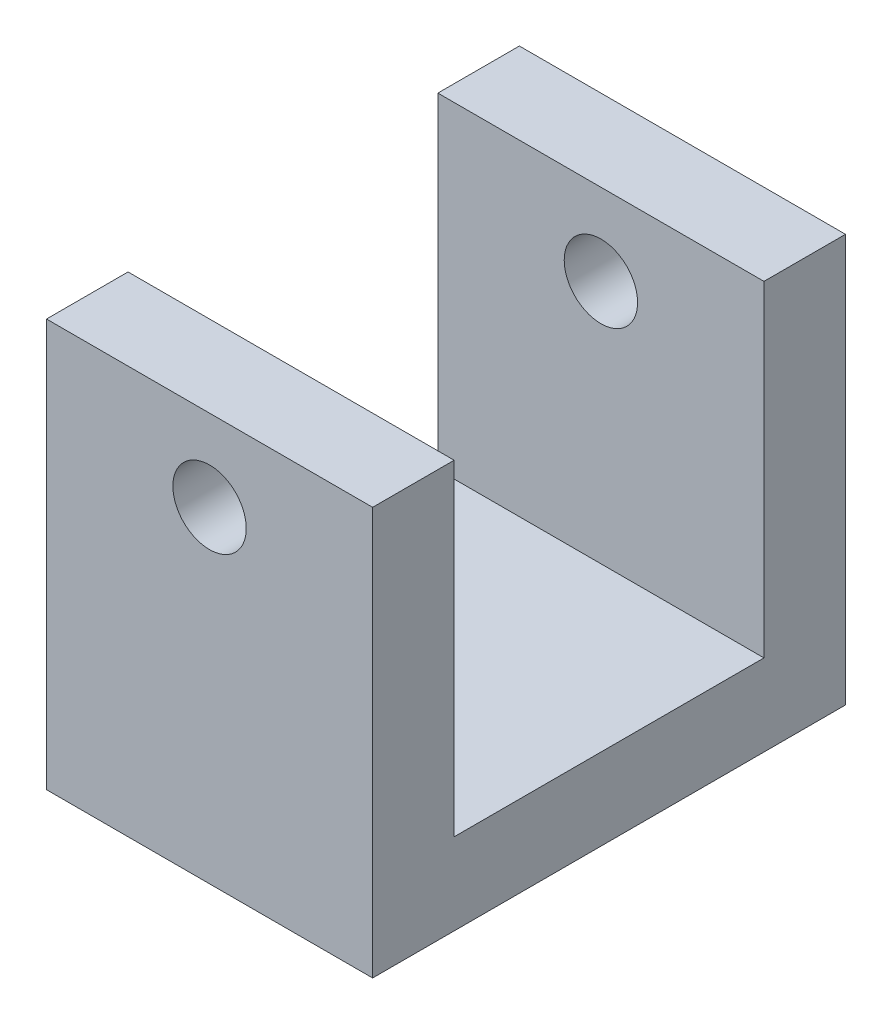
ISO-10303-21;
HEADER;
FILE_DESCRIPTION(('STEP AP214'),'2;1');
FILE_NAME('part.step','',(''),(''),'','','');
FILE_SCHEMA(('AUTOMOTIVE_DESIGN { 1 0 10303 214 1 1 1 1 }'));
ENDSEC;
DATA;
#1=APPLICATION_CONTEXT('core data for automotive mechanical design processes');
#2=APPLICATION_PROTOCOL_DEFINITION('international standard','automotive_design',2000,#1);
#3=PRODUCT_CONTEXT('',#1,'mechanical');
#4=PRODUCT('Part','Part','',(#3));
#5=PRODUCT_RELATED_PRODUCT_CATEGORY('part','',(#4));
#6=PRODUCT_DEFINITION_FORMATION('','',#4);
#7=PRODUCT_DEFINITION_CONTEXT('part definition',#1,'design');
#8=PRODUCT_DEFINITION('design','',#6,#7);
#9=PRODUCT_DEFINITION_SHAPE('','',#8);
#10=(LENGTH_UNIT() NAMED_UNIT(*) SI_UNIT(.MILLI.,.METRE.));
#11=(NAMED_UNIT(*) PLANE_ANGLE_UNIT() SI_UNIT($,.RADIAN.));
#12=(NAMED_UNIT(*) SI_UNIT($,.STERADIAN.) SOLID_ANGLE_UNIT());
#13=UNCERTAINTY_MEASURE_WITH_UNIT(LENGTH_MEASURE(1.E-05),#10,'distance_accuracy_value','');
#14=(GEOMETRIC_REPRESENTATION_CONTEXT(3) GLOBAL_UNCERTAINTY_ASSIGNED_CONTEXT((#13)) GLOBAL_UNIT_ASSIGNED_CONTEXT((#10,
#11,#12)) REPRESENTATION_CONTEXT('',''));
#15=CARTESIAN_POINT('',(0.,0.,0.));
#16=DIRECTION('',(0.,0.,1.));
#17=DIRECTION('',(1.,0.,0.));
#18=AXIS2_PLACEMENT_3D('',#15,#16,#17);
#19=CARTESIAN_POINT('',(0.,5.,0.));
#20=DIRECTION('',(0.,-1.,0.));
#21=DIRECTION('',(0.,0.,-1.));
#22=AXIS2_PLACEMENT_3D('',#19,#20,#21);
#23=PLANE('',#22);
#24=DIRECTION('',(-1.,0.,0.));
#25=VECTOR('',#24,1.);
#26=CARTESIAN_POINT('',(-10.,5.,9.5));
#27=LINE('',#26,#25);
#28=CARTESIAN_POINT('',(10.,5.,9.5));
#29=VERTEX_POINT('',#28);
#30=CARTESIAN_POINT('',(-10.,5.,9.5));
#31=VERTEX_POINT('',#30);
#32=EDGE_CURVE('E49',#29,#31,#27,.T.);
#33=ORIENTED_EDGE('',*,*,#32,.F.);
#34=DIRECTION('',(0.,0.,-1.));
#35=VECTOR('',#34,1.);
#36=CARTESIAN_POINT('',(10.,5.,14.5));
#37=LINE('',#36,#35);
#38=CARTESIAN_POINT('',(10.,5.,-9.5));
#39=VERTEX_POINT('',#38);
#40=EDGE_CURVE('E156',#29,#39,#37,.T.);
#41=ORIENTED_EDGE('',*,*,#40,.T.);
#42=DIRECTION('',(1.,0.,0.));
#43=VECTOR('',#42,1.);
#44=CARTESIAN_POINT('',(-10.,5.,-9.5));
#45=LINE('',#44,#43);
#46=CARTESIAN_POINT('',(-10.,5.,-9.5));
#47=VERTEX_POINT('',#46);
#48=EDGE_CURVE('E135',#47,#39,#45,.T.);
#49=ORIENTED_EDGE('',*,*,#48,.F.);
#50=DIRECTION('',(0.,0.,1.));
#51=VECTOR('',#50,1.);
#52=CARTESIAN_POINT('',(-10.,5.,14.5));
#53=LINE('',#52,#51);
#54=EDGE_CURVE('E54',#47,#31,#53,.T.);
#55=ORIENTED_EDGE('',*,*,#54,.T.);
#56=EDGE_LOOP('',(#33,#41,#49,#55));
#57=FACE_BOUND('',#56,.T.);
#58=ADVANCED_FACE('F33',(#57),#23,.F.);
#59=CARTESIAN_POINT('',(10.,5.,14.5));
#60=DIRECTION('',(-1.,0.,0.));
#61=DIRECTION('',(0.,0.,1.));
#62=AXIS2_PLACEMENT_3D('',#59,#60,#61);
#63=PLANE('',#62);
#64=DIRECTION('',(0.,0.,-1.));
#65=VECTOR('',#64,1.);
#66=CARTESIAN_POINT('',(10.,0.,14.5));
#67=LINE('',#66,#65);
#68=CARTESIAN_POINT('',(10.,0.,14.5));
#69=VERTEX_POINT('',#68);
#70=CARTESIAN_POINT('',(10.,0.,-14.5));
#71=VERTEX_POINT('',#70);
#72=EDGE_CURVE('E155',#69,#71,#67,.T.);
#73=ORIENTED_EDGE('',*,*,#72,.T.);
#74=DIRECTION('',(0.,-1.,0.));
#75=VECTOR('',#74,1.);
#76=CARTESIAN_POINT('',(10.,5.,-14.5));
#77=LINE('',#76,#75);
#78=CARTESIAN_POINT('',(10.,25.,-14.5));
#79=VERTEX_POINT('',#78);
#80=EDGE_CURVE('E11',#79,#71,#77,.T.);
#81=ORIENTED_EDGE('',*,*,#80,.F.);
#82=DIRECTION('',(0.,0.,-1.));
#83=VECTOR('',#82,1.);
#84=CARTESIAN_POINT('',(10.,25.,-14.5));
#85=LINE('',#84,#83);
#86=CARTESIAN_POINT('',(10.,25.,-9.5));
#87=VERTEX_POINT('',#86);
#88=EDGE_CURVE('E141',#87,#79,#85,.T.);
#89=ORIENTED_EDGE('',*,*,#88,.F.);
#90=DIRECTION('',(0.,-1.,0.));
#91=VECTOR('',#90,1.);
#92=CARTESIAN_POINT('',(10.,25.,-9.5));
#93=LINE('',#92,#91);
#94=EDGE_CURVE('E147',#87,#39,#93,.T.);
#95=ORIENTED_EDGE('',*,*,#94,.T.);
#96=ORIENTED_EDGE('',*,*,#40,.F.);
#97=DIRECTION('',(0.,-1.,0.));
#98=VECTOR('',#97,1.);
#99=CARTESIAN_POINT('',(10.,25.,9.5));
#100=LINE('',#99,#98);
#101=CARTESIAN_POINT('',(10.,25.,9.5));
#102=VERTEX_POINT('',#101);
#103=EDGE_CURVE('E132',#102,#29,#100,.T.);
#104=ORIENTED_EDGE('',*,*,#103,.F.);
#105=DIRECTION('',(0.,0.,-1.));
#106=VECTOR('',#105,1.);
#107=CARTESIAN_POINT('',(10.,25.,14.5));
#108=LINE('',#107,#106);
#109=CARTESIAN_POINT('',(10.,25.,14.5));
#110=VERTEX_POINT('',#109);
#111=EDGE_CURVE('E116',#110,#102,#108,.T.);
#112=ORIENTED_EDGE('',*,*,#111,.F.);
#113=DIRECTION('',(0.,-1.,0.));
#114=VECTOR('',#113,1.);
#115=CARTESIAN_POINT('',(10.,5.,14.5));
#116=LINE('',#115,#114);
#117=EDGE_CURVE('E108',#110,#69,#116,.T.);
#118=ORIENTED_EDGE('',*,*,#117,.T.);
#119=EDGE_LOOP('',(#73,#81,#89,#95,#96,#104,#112,#118));
#120=FACE_BOUND('',#119,.T.);
#121=ADVANCED_FACE('F35',(#120),#63,.F.);
#122=CARTESIAN_POINT('',(-10.,5.,-14.5));
#123=DIRECTION('',(0.,0.,1.));
#124=DIRECTION('',(1.,0.,0.));
#125=AXIS2_PLACEMENT_3D('',#122,#123,#124);
#126=PLANE('',#125);
#127=CARTESIAN_POINT('',(0.,20.,-14.5));
#128=DIRECTION('',(0.,0.,-1.));
#129=DIRECTION('',(-1.,0.,0.));
#130=AXIS2_PLACEMENT_3D('',#127,#128,#129);
#131=CIRCLE('',#130,2.25);
#132=CARTESIAN_POINT('',(-2.25,20.,-14.5));
#133=VERTEX_POINT('',#132);
#134=EDGE_CURVE('E210',#133,#133,#131,.T.);
#135=ORIENTED_EDGE('',*,*,#134,.F.);
#136=EDGE_LOOP('',(#135));
#137=FACE_BOUND('',#136,.T.);
#138=DIRECTION('',(-1.,0.,0.));
#139=VECTOR('',#138,1.);
#140=CARTESIAN_POINT('',(-10.,0.,-14.5));
#141=LINE('',#140,#139);
#142=CARTESIAN_POINT('',(-10.,0.,-14.5));
#143=VERTEX_POINT('',#142);
#144=EDGE_CURVE('E162',#71,#143,#141,.T.);
#145=ORIENTED_EDGE('',*,*,#144,.T.);
#146=DIRECTION('',(0.,-1.,0.));
#147=VECTOR('',#146,1.);
#148=CARTESIAN_POINT('',(-10.,5.,-14.5));
#149=LINE('',#148,#147);
#150=CARTESIAN_POINT('',(-10.,25.,-14.5));
#151=VERTEX_POINT('',#150);
#152=EDGE_CURVE('E42',#151,#143,#149,.T.);
#153=ORIENTED_EDGE('',*,*,#152,.F.);
#154=DIRECTION('',(-1.,0.,0.));
#155=VECTOR('',#154,1.);
#156=CARTESIAN_POINT('',(-10.,25.,-14.5));
#157=LINE('',#156,#155);
#158=EDGE_CURVE('E144',#79,#151,#157,.T.);
#159=ORIENTED_EDGE('',*,*,#158,.F.);
#160=ORIENTED_EDGE('',*,*,#80,.T.);
#161=EDGE_LOOP('',(#145,#153,#159,#160));
#162=FACE_BOUND('',#161,.T.);
#163=ADVANCED_FACE('F184',(#137,#162),#126,.F.);
#164=CARTESIAN_POINT('',(-10.,5.,14.5));
#165=DIRECTION('',(1.,0.,0.));
#166=DIRECTION('',(0.,0.,-1.));
#167=AXIS2_PLACEMENT_3D('',#164,#165,#166);
#168=PLANE('',#167);
#169=DIRECTION('',(0.,0.,1.));
#170=VECTOR('',#169,1.);
#171=CARTESIAN_POINT('',(-10.,0.,14.5));
#172=LINE('',#171,#170);
#173=CARTESIAN_POINT('',(-10.,0.,14.5));
#174=VERTEX_POINT('',#173);
#175=EDGE_CURVE('E105',#143,#174,#172,.T.);
#176=ORIENTED_EDGE('',*,*,#175,.T.);
#177=DIRECTION('',(0.,-1.,0.));
#178=VECTOR('',#177,1.);
#179=CARTESIAN_POINT('',(-10.,5.,14.5));
#180=LINE('',#179,#178);
#181=CARTESIAN_POINT('',(-10.,25.,14.5));
#182=VERTEX_POINT('',#181);
#183=EDGE_CURVE('E97',#182,#174,#180,.T.);
#184=ORIENTED_EDGE('',*,*,#183,.F.);
#185=DIRECTION('',(0.,0.,1.));
#186=VECTOR('',#185,1.);
#187=CARTESIAN_POINT('',(-10.,25.,14.5));
#188=LINE('',#187,#186);
#189=CARTESIAN_POINT('',(-10.,25.,9.5));
#190=VERTEX_POINT('',#189);
#191=EDGE_CURVE('E102',#190,#182,#188,.T.);
#192=ORIENTED_EDGE('',*,*,#191,.F.);
#193=DIRECTION('',(0.,-1.,0.));
#194=VECTOR('',#193,1.);
#195=CARTESIAN_POINT('',(-10.,25.,9.5));
#196=LINE('',#195,#194);
#197=EDGE_CURVE('E129',#190,#31,#196,.T.);
#198=ORIENTED_EDGE('',*,*,#197,.T.);
#199=ORIENTED_EDGE('',*,*,#54,.F.);
#200=DIRECTION('',(0.,-1.,0.));
#201=VECTOR('',#200,1.);
#202=CARTESIAN_POINT('',(-10.,25.,-9.5));
#203=LINE('',#202,#201);
#204=CARTESIAN_POINT('',(-10.,25.,-9.5));
#205=VERTEX_POINT('',#204);
#206=EDGE_CURVE('E152',#205,#47,#203,.T.);
#207=ORIENTED_EDGE('',*,*,#206,.F.);
#208=DIRECTION('',(0.,0.,1.));
#209=VECTOR('',#208,1.);
#210=CARTESIAN_POINT('',(-10.,25.,-14.5));
#211=LINE('',#210,#209);
#212=EDGE_CURVE('E136',#151,#205,#211,.T.);
#213=ORIENTED_EDGE('',*,*,#212,.F.);
#214=ORIENTED_EDGE('',*,*,#152,.T.);
#215=EDGE_LOOP('',(#176,#184,#192,#198,#199,#207,#213,#214));
#216=FACE_BOUND('',#215,.T.);
#217=ADVANCED_FACE('F99',(#216),#168,.F.);
#218=CARTESIAN_POINT('',(-10.,5.,14.5));
#219=DIRECTION('',(0.,0.,-1.));
#220=DIRECTION('',(-1.,0.,0.));
#221=AXIS2_PLACEMENT_3D('',#218,#219,#220);
#222=PLANE('',#221);
#223=CARTESIAN_POINT('',(0.,20.,14.5));
#224=DIRECTION('',(0.,0.,-1.));
#225=DIRECTION('',(-1.,0.,0.));
#226=AXIS2_PLACEMENT_3D('',#223,#224,#225);
#227=CIRCLE('',#226,2.25);
#228=CARTESIAN_POINT('',(-2.25,20.,14.5));
#229=VERTEX_POINT('',#228);
#230=EDGE_CURVE('E208',#229,#229,#227,.T.);
#231=ORIENTED_EDGE('',*,*,#230,.T.);
#232=EDGE_LOOP('',(#231));
#233=FACE_BOUND('',#232,.T.);
#234=DIRECTION('',(1.,0.,0.));
#235=VECTOR('',#234,1.);
#236=CARTESIAN_POINT('',(-10.,0.,14.5));
#237=LINE('',#236,#235);
#238=EDGE_CURVE('E158',#174,#69,#237,.T.);
#239=ORIENTED_EDGE('',*,*,#238,.T.);
#240=ORIENTED_EDGE('',*,*,#117,.F.);
#241=DIRECTION('',(1.,0.,0.));
#242=VECTOR('',#241,1.);
#243=CARTESIAN_POINT('',(-10.,25.,14.5));
#244=LINE('',#243,#242);
#245=EDGE_CURVE('E111',#182,#110,#244,.T.);
#246=ORIENTED_EDGE('',*,*,#245,.F.);
#247=ORIENTED_EDGE('',*,*,#183,.T.);
#248=EDGE_LOOP('',(#239,#240,#246,#247));
#249=FACE_BOUND('',#248,.T.);
#250=ADVANCED_FACE('F112',(#233,#249),#222,.F.);
#251=CARTESIAN_POINT('',(0.,0.,0.));
#252=DIRECTION('',(0.,-1.,0.));
#253=DIRECTION('',(0.,0.,-1.));
#254=AXIS2_PLACEMENT_3D('',#251,#252,#253);
#255=PLANE('',#254);
#256=ORIENTED_EDGE('',*,*,#72,.F.);
#257=ORIENTED_EDGE('',*,*,#238,.F.);
#258=ORIENTED_EDGE('',*,*,#175,.F.);
#259=ORIENTED_EDGE('',*,*,#144,.F.);
#260=EDGE_LOOP('',(#256,#257,#258,#259));
#261=FACE_BOUND('',#260,.T.);
#262=ADVANCED_FACE('F173',(#261),#255,.T.);
#263=CARTESIAN_POINT('',(-10.,25.,-9.5));
#264=DIRECTION('',(0.,0.,-1.));
#265=DIRECTION('',(-1.,0.,0.));
#266=AXIS2_PLACEMENT_3D('',#263,#264,#265);
#267=PLANE('',#266);
#268=CARTESIAN_POINT('',(0.,20.,-9.5));
#269=DIRECTION('',(0.,0.,-1.));
#270=DIRECTION('',(-1.,0.,0.));
#271=AXIS2_PLACEMENT_3D('',#268,#269,#270);
#272=CIRCLE('',#271,2.25);
#273=CARTESIAN_POINT('',(-2.25,20.,-9.5));
#274=VERTEX_POINT('',#273);
#275=EDGE_CURVE('E123',#274,#274,#272,.T.);
#276=ORIENTED_EDGE('',*,*,#275,.T.);
#277=EDGE_LOOP('',(#276));
#278=FACE_BOUND('',#277,.T.);
#279=ORIENTED_EDGE('',*,*,#48,.T.);
#280=ORIENTED_EDGE('',*,*,#94,.F.);
#281=DIRECTION('',(1.,0.,0.));
#282=VECTOR('',#281,1.);
#283=CARTESIAN_POINT('',(-10.,25.,-9.5));
#284=LINE('',#283,#282);
#285=EDGE_CURVE('E139',#205,#87,#284,.T.);
#286=ORIENTED_EDGE('',*,*,#285,.F.);
#287=ORIENTED_EDGE('',*,*,#206,.T.);
#288=EDGE_LOOP('',(#279,#280,#286,#287));
#289=FACE_BOUND('',#288,.T.);
#290=ADVANCED_FACE('F179',(#278,#289),#267,.F.);
#291=CARTESIAN_POINT('',(0.,25.,0.));
#292=DIRECTION('',(0.,1.,0.));
#293=DIRECTION('',(0.,0.,1.));
#294=AXIS2_PLACEMENT_3D('',#291,#292,#293);
#295=PLANE('',#294);
#296=ORIENTED_EDGE('',*,*,#212,.T.);
#297=ORIENTED_EDGE('',*,*,#285,.T.);
#298=ORIENTED_EDGE('',*,*,#88,.T.);
#299=ORIENTED_EDGE('',*,*,#158,.T.);
#300=EDGE_LOOP('',(#296,#297,#298,#299));
#301=FACE_BOUND('',#300,.T.);
#302=ADVANCED_FACE('F183',(#301),#295,.T.);
#303=CARTESIAN_POINT('',(-10.,25.,9.5));
#304=DIRECTION('',(0.,0.,1.));
#305=DIRECTION('',(1.,0.,0.));
#306=AXIS2_PLACEMENT_3D('',#303,#304,#305);
#307=PLANE('',#306);
#308=CARTESIAN_POINT('',(0.,20.,9.5));
#309=DIRECTION('',(0.,0.,1.));
#310=DIRECTION('',(1.,0.,0.));
#311=AXIS2_PLACEMENT_3D('',#308,#309,#310);
#312=CIRCLE('',#311,2.25);
#313=CARTESIAN_POINT('',(2.25,20.,9.5));
#314=VERTEX_POINT('',#313);
#315=EDGE_CURVE('E37',#314,#314,#312,.T.);
#316=ORIENTED_EDGE('',*,*,#315,.T.);
#317=EDGE_LOOP('',(#316));
#318=FACE_BOUND('',#317,.T.);
#319=ORIENTED_EDGE('',*,*,#32,.T.);
#320=ORIENTED_EDGE('',*,*,#197,.F.);
#321=DIRECTION('',(-1.,0.,0.));
#322=VECTOR('',#321,1.);
#323=CARTESIAN_POINT('',(-10.,25.,9.5));
#324=LINE('',#323,#322);
#325=EDGE_CURVE('E120',#102,#190,#324,.T.);
#326=ORIENTED_EDGE('',*,*,#325,.F.);
#327=ORIENTED_EDGE('',*,*,#103,.T.);
#328=EDGE_LOOP('',(#319,#320,#326,#327));
#329=FACE_BOUND('',#328,.T.);
#330=ADVANCED_FACE('F177',(#318,#329),#307,.F.);
#331=CARTESIAN_POINT('',(0.,25.,0.));
#332=DIRECTION('',(0.,-1.,0.));
#333=DIRECTION('',(0.,0.,-1.));
#334=AXIS2_PLACEMENT_3D('',#331,#332,#333);
#335=PLANE('',#334);
#336=ORIENTED_EDGE('',*,*,#191,.T.);
#337=ORIENTED_EDGE('',*,*,#245,.T.);
#338=ORIENTED_EDGE('',*,*,#111,.T.);
#339=ORIENTED_EDGE('',*,*,#325,.T.);
#340=EDGE_LOOP('',(#336,#337,#338,#339));
#341=FACE_BOUND('',#340,.T.);
#342=ADVANCED_FACE('F118',(#341),#335,.F.);
#343=CARTESIAN_POINT('',(0.,20.,14.5));
#344=DIRECTION('',(0.,0.,-1.));
#345=DIRECTION('',(-1.,0.,0.));
#346=AXIS2_PLACEMENT_3D('',#343,#344,#345);
#347=CYLINDRICAL_SURFACE('',#346,2.25);
#348=ORIENTED_EDGE('',*,*,#230,.F.);
#349=EDGE_LOOP('',(#348));
#350=FACE_BOUND('',#349,.T.);
#351=ORIENTED_EDGE('',*,*,#315,.F.);
#352=EDGE_LOOP('',(#351));
#353=FACE_BOUND('',#352,.T.);
#354=ADVANCED_FACE('F218',(#350,#353),#347,.F.);
#355=ORIENTED_EDGE('',*,*,#134,.T.);
#356=EDGE_LOOP('',(#355));
#357=FACE_BOUND('',#356,.T.);
#358=ORIENTED_EDGE('',*,*,#275,.F.);
#359=EDGE_LOOP('',(#358));
#360=FACE_BOUND('',#359,.T.);
#361=ADVANCED_FACE('F215',(#357,#360),#347,.F.);
#362=CLOSED_SHELL('',(#58,#121,#163,#217,#250,#262,#290,#302,#330,#342,#354,#361));
#363=MANIFOLD_SOLID_BREP('B2',#362);
#364=ADVANCED_BREP_SHAPE_REPRESENTATION('',(#18,#363),#14);
#365=SHAPE_DEFINITION_REPRESENTATION(#9,#364);
ENDSEC;
END-ISO-10303-21;
